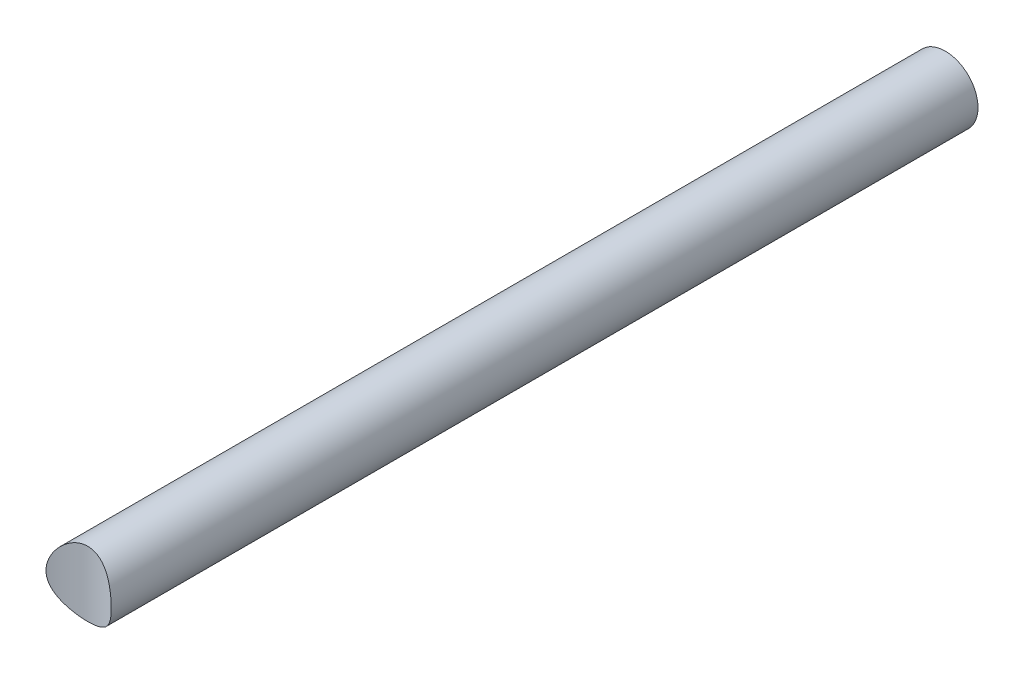
ISO-10303-21;
HEADER;
FILE_DESCRIPTION(('STEP AP214'),'2;1');
FILE_NAME('part.step','',(''),(''),'','','');
FILE_SCHEMA(('AUTOMOTIVE_DESIGN { 1 0 10303 214 1 1 1 1 }'));
ENDSEC;
DATA;
#1=APPLICATION_CONTEXT('core data for automotive mechanical design processes');
#2=APPLICATION_PROTOCOL_DEFINITION('international standard','automotive_design',2000,#1);
#3=PRODUCT_CONTEXT('',#1,'mechanical');
#4=PRODUCT('Part','Part','',(#3));
#5=PRODUCT_RELATED_PRODUCT_CATEGORY('part','',(#4));
#6=PRODUCT_DEFINITION_FORMATION('','',#4);
#7=PRODUCT_DEFINITION_CONTEXT('part definition',#1,'design');
#8=PRODUCT_DEFINITION('design','',#6,#7);
#9=PRODUCT_DEFINITION_SHAPE('','',#8);
#10=(LENGTH_UNIT() NAMED_UNIT(*) SI_UNIT(.MILLI.,.METRE.));
#11=(NAMED_UNIT(*) PLANE_ANGLE_UNIT() SI_UNIT($,.RADIAN.));
#12=(NAMED_UNIT(*) SI_UNIT($,.STERADIAN.) SOLID_ANGLE_UNIT());
#13=UNCERTAINTY_MEASURE_WITH_UNIT(LENGTH_MEASURE(1.E-05),#10,'distance_accuracy_value','');
#14=(GEOMETRIC_REPRESENTATION_CONTEXT(3) GLOBAL_UNCERTAINTY_ASSIGNED_CONTEXT((#13)) GLOBAL_UNIT_ASSIGNED_CONTEXT((#10,
#11,#12)) REPRESENTATION_CONTEXT('',''));
#15=CARTESIAN_POINT('',(0.,0.,0.));
#16=DIRECTION('',(0.,0.,1.));
#17=DIRECTION('',(1.,0.,0.));
#18=AXIS2_PLACEMENT_3D('',#15,#16,#17);
#19=CARTESIAN_POINT('',(27.271,2.665,-10.531));
#20=DIRECTION('',(0.,-1.,0.));
#21=DIRECTION('',(0.,0.,-1.));
#22=AXIS2_PLACEMENT_3D('',#19,#20,#21);
#23=CYLINDRICAL_SURFACE('',#22,0.835);
#24=CARTESIAN_POINT('',(27.706,0.535,-11.2437411872482));
#25=CARTESIAN_POINT('',(27.7059987577011,0.512468460701021,-11.2437428448814));
#26=CARTESIAN_POINT('',(27.7042388471647,0.489925451911581,-11.2448252503581));
#27=CARTESIAN_POINT('',(27.6972982507185,0.445553246415652,-11.2489903714739));
#28=CARTESIAN_POINT('',(27.6921134612012,0.423724939017874,-11.2520754866349));
#29=CARTESIAN_POINT('',(27.6786152975252,0.381494671151208,-11.259789559904));
#30=CARTESIAN_POINT('',(27.6703187790503,0.361085715989322,-11.2644101853254));
#31=CARTESIAN_POINT('',(27.6508859410826,0.321951747761473,-11.2746612432138));
#32=CARTESIAN_POINT('',(27.6397488544875,0.303227191422035,-11.2802919483332));
#33=CARTESIAN_POINT('',(27.6137788976117,0.266141163574626,-11.2925454754614));
#34=CARTESIAN_POINT('',(27.5987037662908,0.24796370979371,-11.2992119811215));
#35=CARTESIAN_POINT('',(27.5657883109157,0.214250461075546,-11.3124343056803));
#36=CARTESIAN_POINT('',(27.5479465801155,0.198716018517231,-11.3189900663769));
#37=CARTESIAN_POINT('',(27.5083768107524,0.169589954393764,-11.3318376766676));
#38=CARTESIAN_POINT('',(27.4864579705967,0.156230329934521,-11.3380731764767));
#39=CARTESIAN_POINT('',(27.440297834958,0.133472949700025,-11.3490000441093));
#40=CARTESIAN_POINT('',(27.4160581405504,0.124072486466401,-11.3536924666778));
#41=CARTESIAN_POINT('',(27.3678997062425,0.110247946798135,-11.360687664718));
#42=CARTESIAN_POINT('',(27.3440971152834,0.105499400745366,-11.363145215174));
#43=CARTESIAN_POINT('',(27.29591647863,0.100039300695197,-11.3659760573353));
#44=CARTESIAN_POINT('',(27.2715388245594,0.0993250746872613,-11.3663507285703));
#45=CARTESIAN_POINT('',(27.2253631559063,0.101841666502373,-11.3650417120112));
#46=CARTESIAN_POINT('',(27.2035384819696,0.104707153258231,-11.3635486207917));
#47=CARTESIAN_POINT('',(27.1607322081954,0.113640163752039,-11.3589670498559));
#48=CARTESIAN_POINT('',(27.1397506683558,0.11970791493194,-11.3558784568188));
#49=CARTESIAN_POINT('',(27.0988808077643,0.134897932317401,-11.3483357864565));
#50=CARTESIAN_POINT('',(27.0790098819727,0.144058238386093,-11.3438647652719));
#51=CARTESIAN_POINT('',(27.0410427067007,0.165113014533237,-11.3339509366336));
#52=CARTESIAN_POINT('',(27.0229470521978,0.177008396829141,-11.328507805092));
#53=CARTESIAN_POINT('',(26.9871070268886,0.204559906739807,-11.3165072830033));
#54=CARTESIAN_POINT('',(26.9695795199527,0.220473425434085,-11.3098928930559));
#55=CARTESIAN_POINT('',(26.9373170432351,0.254931228401333,-11.2966276241849));
#56=CARTESIAN_POINT('',(26.9225849825378,0.273478218499535,-11.2899767145806));
#57=CARTESIAN_POINT('',(26.895263596947,0.314331180754883,-11.2768508093155));
#58=CARTESIAN_POINT('',(26.8829121578377,0.336813435594188,-11.2704248897647));
#59=CARTESIAN_POINT('',(26.862270096305,0.383928074771863,-11.259219982921));
#60=CARTESIAN_POINT('',(26.853970612178,0.408555626922492,-11.254437408453));
#61=CARTESIAN_POINT('',(26.8439843367178,0.450327456135901,-11.2485673192084));
#62=CARTESIAN_POINT('',(26.8409994979238,0.467070442820614,-11.2467722728954));
#63=CARTESIAN_POINT('',(26.8370071236666,0.50087348359002,-11.2443587365668));
#64=CARTESIAN_POINT('',(26.8359990590188,0.517933451583647,-11.2437399316715));
#65=CARTESIAN_POINT('',(26.8360012422989,0.557531539298979,-11.2437428448814));
#66=CARTESIAN_POINT('',(26.8377611528353,0.580074548088419,-11.2448252503581));
#67=CARTESIAN_POINT('',(26.8447017492815,0.624446753584348,-11.2489903714739));
#68=CARTESIAN_POINT('',(26.8498865387988,0.646275060982126,-11.2520754866349));
#69=CARTESIAN_POINT('',(26.8633847024748,0.688505328848793,-11.259789559904));
#70=CARTESIAN_POINT('',(26.8716812209497,0.708914284010679,-11.2644101853254));
#71=CARTESIAN_POINT('',(26.8911140589174,0.748048252238528,-11.2746612432138));
#72=CARTESIAN_POINT('',(26.9022511455125,0.766772808577966,-11.2802919483332));
#73=CARTESIAN_POINT('',(26.9282211023883,0.803858836425373,-11.2925454754614));
#74=CARTESIAN_POINT('',(26.9432962337092,0.822036290206289,-11.2992119811215));
#75=CARTESIAN_POINT('',(26.9762116890843,0.855749538924454,-11.3124343056803));
#76=CARTESIAN_POINT('',(26.9940534198845,0.871283981482768,-11.3189900663769));
#77=CARTESIAN_POINT('',(27.0336231892476,0.900410045606236,-11.3318376766676));
#78=CARTESIAN_POINT('',(27.0555420294033,0.913769670065479,-11.3380731764767));
#79=CARTESIAN_POINT('',(27.101702165042,0.936527050299975,-11.3490000441093));
#80=CARTESIAN_POINT('',(27.1259418594496,0.945927513533599,-11.3536924666778));
#81=CARTESIAN_POINT('',(27.1741002937575,0.959752053201865,-11.360687664718));
#82=CARTESIAN_POINT('',(27.1979028847166,0.964500599254635,-11.363145215174));
#83=CARTESIAN_POINT('',(27.24608352137,0.969960699304803,-11.3659760573353));
#84=CARTESIAN_POINT('',(27.2704611754406,0.970674925312739,-11.3663507285703));
#85=CARTESIAN_POINT('',(27.3166368440937,0.968158333497627,-11.3650417120112));
#86=CARTESIAN_POINT('',(27.3384615180304,0.965292846741769,-11.3635486207917));
#87=CARTESIAN_POINT('',(27.3812677918046,0.95635983624796,-11.3589670498559));
#88=CARTESIAN_POINT('',(27.4022493316442,0.950292085068059,-11.3558784568188));
#89=CARTESIAN_POINT('',(27.4431191922357,0.9351020676826,-11.3483357864565));
#90=CARTESIAN_POINT('',(27.4629901180273,0.925941761613907,-11.3438647652719));
#91=CARTESIAN_POINT('',(27.5009572932993,0.904886985466763,-11.3339509366336));
#92=CARTESIAN_POINT('',(27.5190529478022,0.892991603170859,-11.328507805092));
#93=CARTESIAN_POINT('',(27.5548929731114,0.865440093260194,-11.3165072830033));
#94=CARTESIAN_POINT('',(27.5724204800473,0.849526574565917,-11.3098928930559));
#95=CARTESIAN_POINT('',(27.6046829567649,0.815068771598669,-11.2966276241849));
#96=CARTESIAN_POINT('',(27.6194150174622,0.796521781500466,-11.2899767145806));
#97=CARTESIAN_POINT('',(27.646736403053,0.755668819245117,-11.2768508093155));
#98=CARTESIAN_POINT('',(27.6590878421623,0.733186564405812,-11.2704248897647));
#99=CARTESIAN_POINT('',(27.679729903695,0.686071925228137,-11.259219982921));
#100=CARTESIAN_POINT('',(27.688029387822,0.661444373077508,-11.254437408453));
#101=CARTESIAN_POINT('',(27.6980156632822,0.6196725438641,-11.2485673192084));
#102=CARTESIAN_POINT('',(27.7010005020762,0.602929557179387,-11.2467722728954));
#103=CARTESIAN_POINT('',(27.7049928763334,0.569126516409981,-11.2443587365668));
#104=CARTESIAN_POINT('',(27.7060009409812,0.552066548416353,-11.2437399316715));
#105=CARTESIAN_POINT('',(27.706,0.535,-11.2437411872482));
#106=B_SPLINE_CURVE_WITH_KNOTS('',3,(#24,#25,#26,#27,#28,#29,#30,#31,#32,#33,#34,#35,#36,#37,
#38,#39,#40,#41,#42,#43,#44,#45,#46,#47,#48,#49,#50,#51,#52,#53,#54,#55,#56,#57,#58,#59,#60,#61,
#62,#63,#64,#65,#66,#67,#68,#69,#70,#71,#72,#73,#74,#75,#76,#77,#78,#79,#80,#81,#82,#83,#84,#85,
#86,#87,#88,#89,#90,#91,#92,#93,#94,#95,#96,#97,#98,#99,#100,#101,#102,#103,#104,#105),
.UNSPECIFIED.,.T.,.F.,(4,2,2,2,2,2,2,2,2,2,2,2,2,2,2,2,2,2,2,2,2,2,2,2,2,2,2,2,2,2,2,2,2,2,2,2,
2,2,2,2,4),(0.,0.0675245960565323,0.135130245570082,0.202374855550346,0.269637644361371,
0.342948157634371,0.416296070429321,0.495126250755461,0.573902435466642,0.646679160741764,
0.719407678884921,0.785284297932428,0.851165596519652,0.917888726250873,0.984634142205972,
1.05806718285008,1.13157622753409,1.21050197155423,1.28925432148155,1.34041462612019,
1.39156123322065,1.45908582927718,1.52669147879073,1.593936088771,1.66119887758202,
1.73450939085502,1.80785730364997,1.88668748397611,1.96546366868729,2.03824039396242,
2.11096891210557,2.17684553115309,2.2427268297403,2.30944995947152,2.37619537542662,
2.44962841607073,2.52313746075474,2.60206320477488,2.68081555470221,2.73197585934084,
2.7831224664413),.UNSPECIFIED.);
#107=CARTESIAN_POINT('',(27.706,0.535,-11.2437411872482));
#108=VERTEX_POINT('',#107);
#109=EDGE_CURVE('E18',#108,#108,#106,.T.);
#110=ORIENTED_EDGE('',*,*,#109,.F.);
#111=EDGE_LOOP('',(#110));
#112=FACE_BOUND('',#111,.T.);
#113=ADVANCED_FACE('F14',(#112),#23,.F.);
#114=CARTESIAN_POINT('',(27.271,0.535,-22.8));
#115=DIRECTION('',(0.,0.,-1.));
#116=DIRECTION('',(-1.,0.,0.));
#117=AXIS2_PLACEMENT_3D('',#114,#115,#116);
#118=PLANE('',#117);
#119=CARTESIAN_POINT('',(27.271,0.535,-22.8));
#120=DIRECTION('',(0.,0.,1.));
#121=DIRECTION('',(1.,0.,0.));
#122=AXIS2_PLACEMENT_3D('',#119,#120,#121);
#123=CIRCLE('',#122,0.435);
#124=CARTESIAN_POINT('',(27.706,0.535,-22.8));
#125=VERTEX_POINT('',#124);
#126=EDGE_CURVE('E10',#125,#125,#123,.T.);
#127=ORIENTED_EDGE('',*,*,#126,.F.);
#128=EDGE_LOOP('',(#127));
#129=FACE_BOUND('',#128,.T.);
#130=ADVANCED_FACE('F33',(#129),#118,.T.);
#131=CARTESIAN_POINT('',(27.271,0.535,-6.931));
#132=DIRECTION('',(0.,0.,1.));
#133=DIRECTION('',(1.,0.,0.));
#134=AXIS2_PLACEMENT_3D('',#131,#132,#133);
#135=CYLINDRICAL_SURFACE('',#134,0.435);
#136=ORIENTED_EDGE('',*,*,#109,.T.);
#137=EDGE_LOOP('',(#136));
#138=FACE_BOUND('',#137,.T.);
#139=ORIENTED_EDGE('',*,*,#126,.T.);
#140=EDGE_LOOP('',(#139));
#141=FACE_BOUND('',#140,.T.);
#142=ADVANCED_FACE('F30',(#138,#141),#135,.T.);
#143=CLOSED_SHELL('',(#113,#130,#142));
#144=MANIFOLD_SOLID_BREP('B1',#143);
#145=ADVANCED_BREP_SHAPE_REPRESENTATION('',(#18,#144),#14);
#146=SHAPE_DEFINITION_REPRESENTATION(#9,#145);
ENDSEC;
END-ISO-10303-21;
